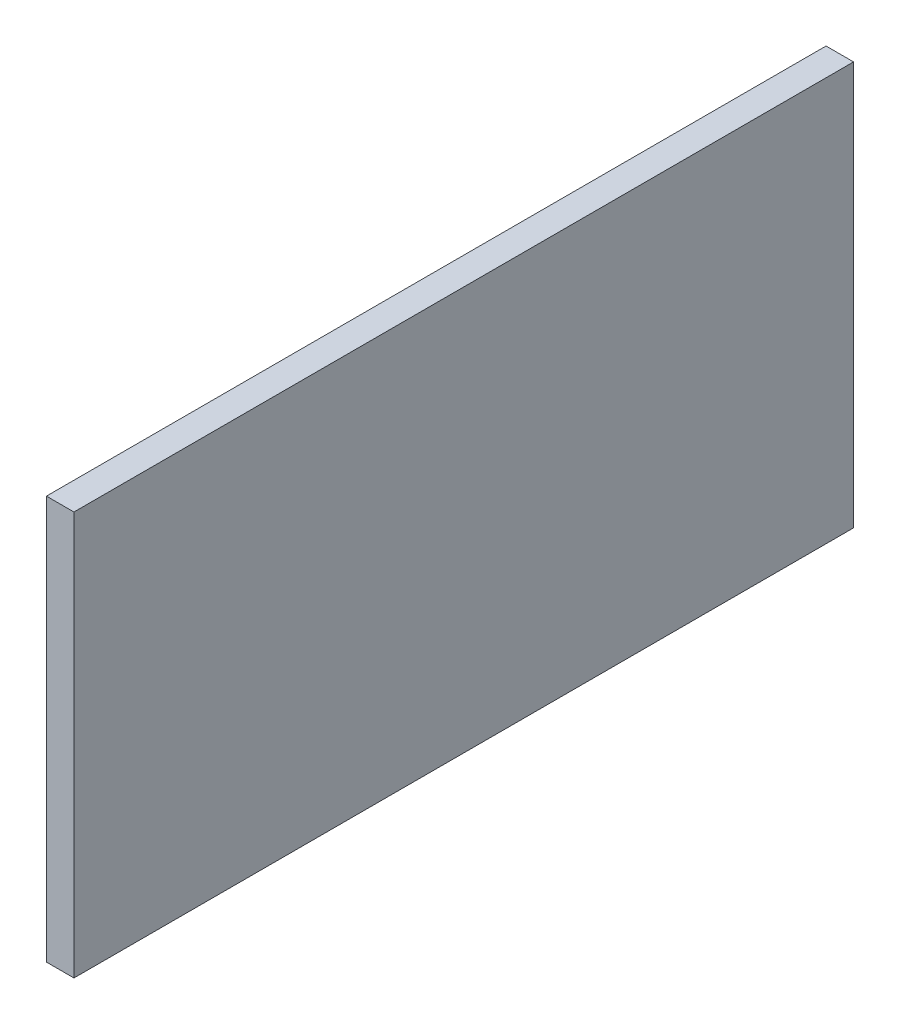
ISO-10303-21;
HEADER;
FILE_DESCRIPTION(('STEP AP214'),'2;1');
FILE_NAME('part.step','',(''),(''),'','','');
FILE_SCHEMA(('AUTOMOTIVE_DESIGN { 1 0 10303 214 1 1 1 1 }'));
ENDSEC;
DATA;
#1=APPLICATION_CONTEXT('core data for automotive mechanical design processes');
#2=APPLICATION_PROTOCOL_DEFINITION('international standard','automotive_design',2000,#1);
#3=PRODUCT_CONTEXT('',#1,'mechanical');
#4=PRODUCT('Part','Part','',(#3));
#5=PRODUCT_RELATED_PRODUCT_CATEGORY('part','',(#4));
#6=PRODUCT_DEFINITION_FORMATION('','',#4);
#7=PRODUCT_DEFINITION_CONTEXT('part definition',#1,'design');
#8=PRODUCT_DEFINITION('design','',#6,#7);
#9=PRODUCT_DEFINITION_SHAPE('','',#8);
#10=(LENGTH_UNIT() NAMED_UNIT(*) SI_UNIT(.MILLI.,.METRE.));
#11=(NAMED_UNIT(*) PLANE_ANGLE_UNIT() SI_UNIT($,.RADIAN.));
#12=(NAMED_UNIT(*) SI_UNIT($,.STERADIAN.) SOLID_ANGLE_UNIT());
#13=UNCERTAINTY_MEASURE_WITH_UNIT(LENGTH_MEASURE(1.E-05),#10,'distance_accuracy_value','');
#14=(GEOMETRIC_REPRESENTATION_CONTEXT(3) GLOBAL_UNCERTAINTY_ASSIGNED_CONTEXT((#13)) GLOBAL_UNIT_ASSIGNED_CONTEXT((#10,
#11,#12)) REPRESENTATION_CONTEXT('',''));
#15=CARTESIAN_POINT('',(0.,0.,0.));
#16=DIRECTION('',(0.,0.,1.));
#17=DIRECTION('',(1.,0.,0.));
#18=AXIS2_PLACEMENT_3D('',#15,#16,#17);
#19=CARTESIAN_POINT('',(122.,0.,0.));
#20=DIRECTION('',(-1.,0.,0.));
#21=DIRECTION('',(0.,0.,1.));
#22=AXIS2_PLACEMENT_3D('',#19,#20,#21);
#23=PLANE('',#22);
#24=DIRECTION('',(0.,-1.,0.));
#25=VECTOR('',#24,1.);
#26=CARTESIAN_POINT('',(122.,2.,47.));
#27=LINE('',#26,#25);
#28=CARTESIAN_POINT('',(122.,46.,47.));
#29=VERTEX_POINT('',#28);
#30=CARTESIAN_POINT('',(122.,2.,47.));
#31=VERTEX_POINT('',#30);
#32=EDGE_CURVE('E261',#29,#31,#27,.T.);
#33=ORIENTED_EDGE('',*,*,#32,.F.);
#34=DIRECTION('',(0.,0.,1.));
#35=VECTOR('',#34,1.);
#36=CARTESIAN_POINT('',(122.,46.,47.));
#37=LINE('',#36,#35);
#38=CARTESIAN_POINT('',(122.,46.,-38.));
#39=VERTEX_POINT('',#38);
#40=EDGE_CURVE('E267',#39,#29,#37,.T.);
#41=ORIENTED_EDGE('',*,*,#40,.F.);
#42=DIRECTION('',(0.,1.,0.));
#43=VECTOR('',#42,1.);
#44=CARTESIAN_POINT('',(122.,2.,-38.));
#45=LINE('',#44,#43);
#46=CARTESIAN_POINT('',(122.,2.,-38.));
#47=VERTEX_POINT('',#46);
#48=EDGE_CURVE('E283',#47,#39,#45,.T.);
#49=ORIENTED_EDGE('',*,*,#48,.F.);
#50=DIRECTION('',(0.,0.,-1.));
#51=VECTOR('',#50,1.);
#52=CARTESIAN_POINT('',(122.,2.,47.));
#53=LINE('',#52,#51);
#54=EDGE_CURVE('E280',#31,#47,#53,.T.);
#55=ORIENTED_EDGE('',*,*,#54,.F.);
#56=EDGE_LOOP('',(#33,#41,#49,#55));
#57=FACE_BOUND('',#56,.T.);
#58=DIRECTION('',(0.,0.,1.));
#59=VECTOR('',#58,1.);
#60=CARTESIAN_POINT('',(122.,25.,0.));
#61=LINE('',#60,#59);
#62=CARTESIAN_POINT('',(122.,25.,12.));
#63=VERTEX_POINT('',#62);
#64=CARTESIAN_POINT('',(122.,25.,16.2));
#65=VERTEX_POINT('',#64);
#66=EDGE_CURVE('E307',#63,#65,#61,.T.);
#67=ORIENTED_EDGE('',*,*,#66,.T.);
#68=DIRECTION('',(0.,-1.,0.));
#69=VECTOR('',#68,1.);
#70=CARTESIAN_POINT('',(122.,0.,16.2));
#71=LINE('',#70,#69);
#72=CARTESIAN_POINT('',(122.,12.,16.2));
#73=VERTEX_POINT('',#72);
#74=EDGE_CURVE('E313',#65,#73,#71,.T.);
#75=ORIENTED_EDGE('',*,*,#74,.T.);
#76=DIRECTION('',(0.,0.,-1.));
#77=VECTOR('',#76,1.);
#78=CARTESIAN_POINT('',(122.,12.,0.));
#79=LINE('',#78,#77);
#80=CARTESIAN_POINT('',(122.,12.,12.));
#81=VERTEX_POINT('',#80);
#82=EDGE_CURVE('E310',#73,#81,#79,.T.);
#83=ORIENTED_EDGE('',*,*,#82,.T.);
#84=DIRECTION('',(0.,-1.,0.));
#85=VECTOR('',#84,1.);
#86=CARTESIAN_POINT('',(122.,0.,12.));
#87=LINE('',#86,#85);
#88=EDGE_CURVE('E303',#63,#81,#87,.T.);
#89=ORIENTED_EDGE('',*,*,#88,.F.);
#90=EDGE_LOOP('',(#67,#75,#83,#89));
#91=FACE_BOUND('',#90,.T.);
#92=DIRECTION('',(0.,0.,1.));
#93=VECTOR('',#92,1.);
#94=CARTESIAN_POINT('',(122.,25.,0.));
#95=LINE('',#94,#93);
#96=CARTESIAN_POINT('',(122.,25.,-26.));
#97=VERTEX_POINT('',#96);
#98=CARTESIAN_POINT('',(122.,25.,-23.));
#99=VERTEX_POINT('',#98);
#100=EDGE_CURVE('E58',#97,#99,#95,.T.);
#101=ORIENTED_EDGE('',*,*,#100,.T.);
#102=DIRECTION('',(0.,-1.,0.));
#103=VECTOR('',#102,1.);
#104=CARTESIAN_POINT('',(122.,0.,-23.));
#105=LINE('',#104,#103);
#106=CARTESIAN_POINT('',(122.,12.,-23.));
#107=VERTEX_POINT('',#106);
#108=EDGE_CURVE('E11',#99,#107,#105,.T.);
#109=ORIENTED_EDGE('',*,*,#108,.T.);
#110=DIRECTION('',(0.,0.,-1.));
#111=VECTOR('',#110,1.);
#112=CARTESIAN_POINT('',(122.,12.,0.));
#113=LINE('',#112,#111);
#114=CARTESIAN_POINT('',(122.,12.,-26.));
#115=VERTEX_POINT('',#114);
#116=EDGE_CURVE('E48',#107,#115,#113,.T.);
#117=ORIENTED_EDGE('',*,*,#116,.T.);
#118=DIRECTION('',(0.,-1.,0.));
#119=VECTOR('',#118,1.);
#120=CARTESIAN_POINT('',(122.,0.,-26.));
#121=LINE('',#120,#119);
#122=EDGE_CURVE('E324',#97,#115,#121,.T.);
#123=ORIENTED_EDGE('',*,*,#122,.F.);
#124=EDGE_LOOP('',(#101,#109,#117,#123));
#125=FACE_BOUND('',#124,.T.);
#126=ADVANCED_FACE('F39',(#57,#91,#125),#23,.T.);
#127=CARTESIAN_POINT('',(125.,2.,47.));
#128=DIRECTION('',(0.,0.,-1.));
#129=DIRECTION('',(-1.,0.,0.));
#130=AXIS2_PLACEMENT_3D('',#127,#128,#129);
#131=PLANE('',#130);
#132=ORIENTED_EDGE('',*,*,#32,.T.);
#133=DIRECTION('',(-1.,0.,0.));
#134=VECTOR('',#133,1.);
#135=CARTESIAN_POINT('',(125.,2.,47.));
#136=LINE('',#135,#134);
#137=CARTESIAN_POINT('',(125.,2.,47.));
#138=VERTEX_POINT('',#137);
#139=EDGE_CURVE('E299',#138,#31,#136,.T.);
#140=ORIENTED_EDGE('',*,*,#139,.F.);
#141=DIRECTION('',(0.,-1.,0.));
#142=VECTOR('',#141,1.);
#143=CARTESIAN_POINT('',(125.,2.,47.));
#144=LINE('',#143,#142);
#145=CARTESIAN_POINT('',(125.,46.,47.));
#146=VERTEX_POINT('',#145);
#147=EDGE_CURVE('E262',#146,#138,#144,.T.);
#148=ORIENTED_EDGE('',*,*,#147,.F.);
#149=DIRECTION('',(-1.,0.,0.));
#150=VECTOR('',#149,1.);
#151=CARTESIAN_POINT('',(125.,46.,47.));
#152=LINE('',#151,#150);
#153=EDGE_CURVE('E276',#146,#29,#152,.T.);
#154=ORIENTED_EDGE('',*,*,#153,.T.);
#155=EDGE_LOOP('',(#132,#140,#148,#154));
#156=FACE_BOUND('',#155,.T.);
#157=ADVANCED_FACE('F41',(#156),#131,.F.);
#158=CARTESIAN_POINT('',(125.,2.,47.));
#159=DIRECTION('',(0.,1.,0.));
#160=DIRECTION('',(0.,0.,1.));
#161=AXIS2_PLACEMENT_3D('',#158,#159,#160);
#162=PLANE('',#161);
#163=ORIENTED_EDGE('',*,*,#54,.T.);
#164=DIRECTION('',(-1.,0.,0.));
#165=VECTOR('',#164,1.);
#166=CARTESIAN_POINT('',(125.,2.,-38.));
#167=LINE('',#166,#165);
#168=CARTESIAN_POINT('',(125.,2.,-38.));
#169=VERTEX_POINT('',#168);
#170=EDGE_CURVE('E295',#169,#47,#167,.T.);
#171=ORIENTED_EDGE('',*,*,#170,.F.);
#172=DIRECTION('',(0.,0.,-1.));
#173=VECTOR('',#172,1.);
#174=CARTESIAN_POINT('',(125.,2.,47.));
#175=LINE('',#174,#173);
#176=EDGE_CURVE('E266',#138,#169,#175,.T.);
#177=ORIENTED_EDGE('',*,*,#176,.F.);
#178=ORIENTED_EDGE('',*,*,#139,.T.);
#179=EDGE_LOOP('',(#163,#171,#177,#178));
#180=FACE_BOUND('',#179,.T.);
#181=ADVANCED_FACE('F351',(#180),#162,.F.);
#182=CARTESIAN_POINT('',(125.,2.,-38.));
#183=DIRECTION('',(0.,0.,1.));
#184=DIRECTION('',(1.,0.,0.));
#185=AXIS2_PLACEMENT_3D('',#182,#183,#184);
#186=PLANE('',#185);
#187=ORIENTED_EDGE('',*,*,#48,.T.);
#188=DIRECTION('',(-1.,0.,0.));
#189=VECTOR('',#188,1.);
#190=CARTESIAN_POINT('',(125.,46.,-38.));
#191=LINE('',#190,#189);
#192=CARTESIAN_POINT('',(125.,46.,-38.));
#193=VERTEX_POINT('',#192);
#194=EDGE_CURVE('E291',#193,#39,#191,.T.);
#195=ORIENTED_EDGE('',*,*,#194,.F.);
#196=DIRECTION('',(0.,1.,0.));
#197=VECTOR('',#196,1.);
#198=CARTESIAN_POINT('',(125.,2.,-38.));
#199=LINE('',#198,#197);
#200=EDGE_CURVE('E270',#169,#193,#199,.T.);
#201=ORIENTED_EDGE('',*,*,#200,.F.);
#202=ORIENTED_EDGE('',*,*,#170,.T.);
#203=EDGE_LOOP('',(#187,#195,#201,#202));
#204=FACE_BOUND('',#203,.T.);
#205=ADVANCED_FACE('F362',(#204),#186,.F.);
#206=CARTESIAN_POINT('',(125.,46.,47.));
#207=DIRECTION('',(0.,-1.,0.));
#208=DIRECTION('',(0.,0.,-1.));
#209=AXIS2_PLACEMENT_3D('',#206,#207,#208);
#210=PLANE('',#209);
#211=ORIENTED_EDGE('',*,*,#40,.T.);
#212=ORIENTED_EDGE('',*,*,#153,.F.);
#213=DIRECTION('',(0.,0.,1.));
#214=VECTOR('',#213,1.);
#215=CARTESIAN_POINT('',(125.,46.,47.));
#216=LINE('',#215,#214);
#217=EDGE_CURVE('E273',#193,#146,#216,.T.);
#218=ORIENTED_EDGE('',*,*,#217,.F.);
#219=ORIENTED_EDGE('',*,*,#194,.T.);
#220=EDGE_LOOP('',(#211,#212,#218,#219));
#221=FACE_BOUND('',#220,.T.);
#222=ADVANCED_FACE('F359',(#221),#210,.F.);
#223=CARTESIAN_POINT('',(125.,0.,0.));
#224=DIRECTION('',(-1.,0.,0.));
#225=DIRECTION('',(0.,0.,1.));
#226=AXIS2_PLACEMENT_3D('',#223,#224,#225);
#227=PLANE('',#226);
#228=ORIENTED_EDGE('',*,*,#147,.T.);
#229=ORIENTED_EDGE('',*,*,#176,.T.);
#230=ORIENTED_EDGE('',*,*,#200,.T.);
#231=ORIENTED_EDGE('',*,*,#217,.T.);
#232=EDGE_LOOP('',(#228,#229,#230,#231));
#233=FACE_BOUND('',#232,.T.);
#234=ADVANCED_FACE('F357',(#233),#227,.F.);
#235=CARTESIAN_POINT('',(108.2,12.,16.2));
#236=DIRECTION('',(0.,1.,0.));
#237=DIRECTION('',(0.,0.,1.));
#238=AXIS2_PLACEMENT_3D('',#235,#236,#237);
#239=PLANE('',#238);
#240=ORIENTED_EDGE('',*,*,#82,.F.);
#241=DIRECTION('',(1.,0.,0.));
#242=VECTOR('',#241,1.);
#243=CARTESIAN_POINT('',(108.2,12.,16.2));
#244=LINE('',#243,#242);
#245=CARTESIAN_POINT('',(108.2,12.,16.2));
#246=VERTEX_POINT('',#245);
#247=EDGE_CURVE('E240',#246,#73,#244,.T.);
#248=ORIENTED_EDGE('',*,*,#247,.F.);
#249=DIRECTION('',(0.,0.,-1.));
#250=VECTOR('',#249,1.);
#251=CARTESIAN_POINT('',(108.2,12.,16.2));
#252=LINE('',#251,#250);
#253=CARTESIAN_POINT('',(108.2,12.,12.));
#254=VERTEX_POINT('',#253);
#255=EDGE_CURVE('E257',#246,#254,#252,.T.);
#256=ORIENTED_EDGE('',*,*,#255,.T.);
#257=DIRECTION('',(1.,0.,0.));
#258=VECTOR('',#257,1.);
#259=CARTESIAN_POINT('',(108.2,12.,12.));
#260=LINE('',#259,#258);
#261=EDGE_CURVE('E236',#254,#81,#260,.T.);
#262=ORIENTED_EDGE('',*,*,#261,.T.);
#263=EDGE_LOOP('',(#240,#248,#256,#262));
#264=FACE_BOUND('',#263,.T.);
#265=ADVANCED_FACE('F381',(#264),#239,.F.);
#266=CARTESIAN_POINT('',(108.2,25.,16.2));
#267=DIRECTION('',(0.,-1.,0.));
#268=DIRECTION('',(0.,0.,-1.));
#269=AXIS2_PLACEMENT_3D('',#266,#267,#268);
#270=PLANE('',#269);
#271=ORIENTED_EDGE('',*,*,#66,.F.);
#272=DIRECTION('',(-1.,0.,0.));
#273=VECTOR('',#272,1.);
#274=CARTESIAN_POINT('',(108.2,25.,12.));
#275=LINE('',#274,#273);
#276=CARTESIAN_POINT('',(108.2,25.,12.));
#277=VERTEX_POINT('',#276);
#278=EDGE_CURVE('E245',#63,#277,#275,.T.);
#279=ORIENTED_EDGE('',*,*,#278,.T.);
#280=DIRECTION('',(0.,0.,-1.));
#281=VECTOR('',#280,1.);
#282=CARTESIAN_POINT('',(108.2,25.,16.2));
#283=LINE('',#282,#281);
#284=CARTESIAN_POINT('',(108.2,25.,16.2));
#285=VERTEX_POINT('',#284);
#286=EDGE_CURVE('E248',#285,#277,#283,.T.);
#287=ORIENTED_EDGE('',*,*,#286,.F.);
#288=DIRECTION('',(-1.,0.,0.));
#289=VECTOR('',#288,1.);
#290=CARTESIAN_POINT('',(108.2,25.,16.2));
#291=LINE('',#290,#289);
#292=EDGE_CURVE('E244',#65,#285,#291,.T.);
#293=ORIENTED_EDGE('',*,*,#292,.F.);
#294=EDGE_LOOP('',(#271,#279,#287,#293));
#295=FACE_BOUND('',#294,.T.);
#296=ADVANCED_FACE('F385',(#295),#270,.F.);
#297=CARTESIAN_POINT('',(0.,0.,16.2));
#298=DIRECTION('',(0.,0.,-1.));
#299=DIRECTION('',(-1.,0.,0.));
#300=AXIS2_PLACEMENT_3D('',#297,#298,#299);
#301=PLANE('',#300);
#302=CARTESIAN_POINT('',(108.2,18.5,16.2));
#303=DIRECTION('',(0.,0.,1.));
#304=DIRECTION('',(1.,0.,0.));
#305=AXIS2_PLACEMENT_3D('',#302,#303,#304);
#306=CIRCLE('',#305,3.55);
#307=CARTESIAN_POINT('',(108.835894584196,21.9925832957554,16.2));
#308=VERTEX_POINT('',#307);
#309=CARTESIAN_POINT('',(108.835894584196,15.0074167042445,16.2));
#310=VERTEX_POINT('',#309);
#311=EDGE_CURVE('E222',#308,#310,#306,.T.);
#312=ORIENTED_EDGE('',*,*,#311,.F.);
#313=DIRECTION('',(-0.995948362239352,0.0899269689956982,0.));
#314=VECTOR('',#313,1.);
#315=CARTESIAN_POINT('',(120.9,20.9032814053959,16.2));
#316=LINE('',#315,#314);
#317=CARTESIAN_POINT('',(120.9,20.9032814053959,16.2));
#318=VERTEX_POINT('',#317);
#319=EDGE_CURVE('E202',#318,#308,#316,.T.);
#320=ORIENTED_EDGE('',*,*,#319,.F.);
#321=DIRECTION('',(0.,1.,0.));
#322=VECTOR('',#321,1.);
#323=CARTESIAN_POINT('',(120.9,16.0967185946041,16.2));
#324=LINE('',#323,#322);
#325=CARTESIAN_POINT('',(120.9,16.0967185946041,16.2));
#326=VERTEX_POINT('',#325);
#327=EDGE_CURVE('E213',#326,#318,#324,.T.);
#328=ORIENTED_EDGE('',*,*,#327,.F.);
#329=DIRECTION('',(0.995948362239352,0.0899269689956982,0.));
#330=VECTOR('',#329,1.);
#331=CARTESIAN_POINT('',(108.2,14.95,16.2));
#332=LINE('',#331,#330);
#333=EDGE_CURVE('E196',#310,#326,#332,.T.);
#334=ORIENTED_EDGE('',*,*,#333,.F.);
#335=EDGE_LOOP('',(#312,#320,#328,#334));
#336=FACE_BOUND('',#335,.T.);
#337=ORIENTED_EDGE('',*,*,#292,.T.);
#338=CARTESIAN_POINT('',(108.2,18.5,16.2));
#339=DIRECTION('',(0.,0.,1.));
#340=DIRECTION('',(1.,0.,0.));
#341=AXIS2_PLACEMENT_3D('',#338,#339,#340);
#342=CIRCLE('',#341,6.50000000000001);
#343=EDGE_CURVE('E232',#285,#246,#342,.T.);
#344=ORIENTED_EDGE('',*,*,#343,.T.);
#345=ORIENTED_EDGE('',*,*,#247,.T.);
#346=ORIENTED_EDGE('',*,*,#74,.F.);
#347=EDGE_LOOP('',(#337,#344,#345,#346));
#348=FACE_BOUND('',#347,.T.);
#349=ADVANCED_FACE('F390',(#336,#348),#301,.F.);
#350=CARTESIAN_POINT('',(0.,0.,12.));
#351=DIRECTION('',(0.,0.,-1.));
#352=DIRECTION('',(-1.,0.,0.));
#353=AXIS2_PLACEMENT_3D('',#350,#351,#352);
#354=PLANE('',#353);
#355=DIRECTION('',(-0.995948362239352,0.0899269689956982,0.));
#356=VECTOR('',#355,1.);
#357=CARTESIAN_POINT('',(120.9,20.9032814053959,12.));
#358=LINE('',#357,#356);
#359=CARTESIAN_POINT('',(120.9,20.9032814053959,12.));
#360=VERTEX_POINT('',#359);
#361=CARTESIAN_POINT('',(108.835894584196,21.9925832957554,12.));
#362=VERTEX_POINT('',#361);
#363=EDGE_CURVE('E206',#360,#362,#358,.T.);
#364=ORIENTED_EDGE('',*,*,#363,.T.);
#365=CARTESIAN_POINT('',(108.2,18.5,12.));
#366=DIRECTION('',(0.,0.,1.));
#367=DIRECTION('',(1.,0.,0.));
#368=AXIS2_PLACEMENT_3D('',#365,#366,#367);
#369=CIRCLE('',#368,3.55);
#370=CARTESIAN_POINT('',(108.835894584196,15.0074167042445,12.));
#371=VERTEX_POINT('',#370);
#372=EDGE_CURVE('E226',#362,#371,#369,.T.);
#373=ORIENTED_EDGE('',*,*,#372,.T.);
#374=DIRECTION('',(0.995948362239352,0.0899269689956982,0.));
#375=VECTOR('',#374,1.);
#376=CARTESIAN_POINT('',(108.2,14.95,12.));
#377=LINE('',#376,#375);
#378=CARTESIAN_POINT('',(120.9,16.0967185946041,12.));
#379=VERTEX_POINT('',#378);
#380=EDGE_CURVE('E197',#371,#379,#377,.T.);
#381=ORIENTED_EDGE('',*,*,#380,.T.);
#382=DIRECTION('',(0.,1.,0.));
#383=VECTOR('',#382,1.);
#384=CARTESIAN_POINT('',(120.9,16.0967185946041,12.));
#385=LINE('',#384,#383);
#386=EDGE_CURVE('E201',#379,#360,#385,.T.);
#387=ORIENTED_EDGE('',*,*,#386,.T.);
#388=EDGE_LOOP('',(#364,#373,#381,#387));
#389=FACE_BOUND('',#388,.T.);
#390=ORIENTED_EDGE('',*,*,#261,.F.);
#391=CARTESIAN_POINT('',(108.2,18.5,12.));
#392=DIRECTION('',(0.,0.,1.));
#393=DIRECTION('',(1.,0.,0.));
#394=AXIS2_PLACEMENT_3D('',#391,#392,#393);
#395=CIRCLE('',#394,6.50000000000001);
#396=EDGE_CURVE('E229',#277,#254,#395,.T.);
#397=ORIENTED_EDGE('',*,*,#396,.F.);
#398=ORIENTED_EDGE('',*,*,#278,.F.);
#399=ORIENTED_EDGE('',*,*,#88,.T.);
#400=EDGE_LOOP('',(#390,#397,#398,#399));
#401=FACE_BOUND('',#400,.T.);
#402=ADVANCED_FACE('F395',(#389,#401),#354,.T.);
#403=CARTESIAN_POINT('',(108.2,18.5,16.2));
#404=DIRECTION('',(0.,0.,-1.));
#405=DIRECTION('',(-1.,0.,0.));
#406=AXIS2_PLACEMENT_3D('',#403,#404,#405);
#407=CYLINDRICAL_SURFACE('',#406,6.50000000000001);
#408=ORIENTED_EDGE('',*,*,#396,.T.);
#409=ORIENTED_EDGE('',*,*,#255,.F.);
#410=ORIENTED_EDGE('',*,*,#343,.F.);
#411=ORIENTED_EDGE('',*,*,#286,.T.);
#412=EDGE_LOOP('',(#408,#409,#410,#411));
#413=FACE_BOUND('',#412,.T.);
#414=ADVANCED_FACE('F398',(#413),#407,.T.);
#415=CARTESIAN_POINT('',(108.2,18.5,12.));
#416=DIRECTION('',(0.,0.,1.));
#417=DIRECTION('',(1.,0.,0.));
#418=AXIS2_PLACEMENT_3D('',#415,#416,#417);
#419=CYLINDRICAL_SURFACE('',#418,3.55);
#420=ORIENTED_EDGE('',*,*,#311,.T.);
#421=DIRECTION('',(0.,0.,1.));
#422=VECTOR('',#421,1.);
#423=CARTESIAN_POINT('',(108.835894584196,15.0074167042445,12.));
#424=LINE('',#423,#422);
#425=EDGE_CURVE('E316',#310,#371,#424,.F.);
#426=ORIENTED_EDGE('',*,*,#425,.T.);
#427=ORIENTED_EDGE('',*,*,#372,.F.);
#428=DIRECTION('',(0.,0.,1.));
#429=VECTOR('',#428,1.);
#430=CARTESIAN_POINT('',(108.835894584196,21.9925832957554,12.));
#431=LINE('',#430,#429);
#432=EDGE_CURVE('E320',#362,#308,#431,.T.);
#433=ORIENTED_EDGE('',*,*,#432,.T.);
#434=EDGE_LOOP('',(#420,#426,#427,#433));
#435=FACE_BOUND('',#434,.T.);
#436=ADVANCED_FACE('F405',(#435),#419,.F.);
#437=CARTESIAN_POINT('',(120.9,20.9032814053959,12.));
#438=DIRECTION('',(0.0899269689956982,0.995948362239352,0.));
#439=DIRECTION('',(-0.995948362239352,0.0899269689956982,0.));
#440=AXIS2_PLACEMENT_3D('',#437,#438,#439);
#441=PLANE('',#440);
#442=ORIENTED_EDGE('',*,*,#363,.F.);
#443=DIRECTION('',(0.,0.,1.));
#444=VECTOR('',#443,1.);
#445=CARTESIAN_POINT('',(120.9,20.9032814053959,12.));
#446=LINE('',#445,#444);
#447=EDGE_CURVE('E219',#360,#318,#446,.T.);
#448=ORIENTED_EDGE('',*,*,#447,.T.);
#449=ORIENTED_EDGE('',*,*,#319,.T.);
#450=ORIENTED_EDGE('',*,*,#432,.F.);
#451=EDGE_LOOP('',(#442,#448,#449,#450));
#452=FACE_BOUND('',#451,.T.);
#453=ADVANCED_FACE('F409',(#452),#441,.F.);
#454=CARTESIAN_POINT('',(108.2,14.95,12.));
#455=DIRECTION('',(0.0899269689956982,-0.995948362239352,0.));
#456=DIRECTION('',(0.995948362239352,0.0899269689956982,0.));
#457=AXIS2_PLACEMENT_3D('',#454,#455,#456);
#458=PLANE('',#457);
#459=ORIENTED_EDGE('',*,*,#333,.T.);
#460=DIRECTION('',(0.,0.,1.));
#461=VECTOR('',#460,1.);
#462=CARTESIAN_POINT('',(120.9,16.0967185946041,12.));
#463=LINE('',#462,#461);
#464=EDGE_CURVE('E210',#379,#326,#463,.T.);
#465=ORIENTED_EDGE('',*,*,#464,.F.);
#466=ORIENTED_EDGE('',*,*,#380,.F.);
#467=ORIENTED_EDGE('',*,*,#425,.F.);
#468=EDGE_LOOP('',(#459,#465,#466,#467));
#469=FACE_BOUND('',#468,.T.);
#470=ADVANCED_FACE('F411',(#469),#458,.F.);
#471=CARTESIAN_POINT('',(120.9,16.0967185946041,12.));
#472=DIRECTION('',(1.,0.,0.));
#473=DIRECTION('',(0.,0.,-1.));
#474=AXIS2_PLACEMENT_3D('',#471,#472,#473);
#475=PLANE('',#474);
#476=ORIENTED_EDGE('',*,*,#327,.T.);
#477=ORIENTED_EDGE('',*,*,#447,.F.);
#478=ORIENTED_EDGE('',*,*,#386,.F.);
#479=ORIENTED_EDGE('',*,*,#464,.T.);
#480=EDGE_LOOP('',(#476,#477,#478,#479));
#481=FACE_BOUND('',#480,.T.);
#482=ADVANCED_FACE('F414',(#481),#475,.F.);
#483=CARTESIAN_POINT('',(108.2,12.,-23.));
#484=DIRECTION('',(0.,1.,0.));
#485=DIRECTION('',(0.,0.,1.));
#486=AXIS2_PLACEMENT_3D('',#483,#484,#485);
#487=PLANE('',#486);
#488=ORIENTED_EDGE('',*,*,#116,.F.);
#489=DIRECTION('',(1.,0.,0.));
#490=VECTOR('',#489,1.);
#491=CARTESIAN_POINT('',(108.2,12.,-23.));
#492=LINE('',#491,#490);
#493=CARTESIAN_POINT('',(108.2,12.,-23.));
#494=VERTEX_POINT('',#493);
#495=EDGE_CURVE('E159',#494,#107,#492,.T.);
#496=ORIENTED_EDGE('',*,*,#495,.F.);
#497=DIRECTION('',(0.,0.,-1.));
#498=VECTOR('',#497,1.);
#499=CARTESIAN_POINT('',(108.2,12.,-23.));
#500=LINE('',#499,#498);
#501=CARTESIAN_POINT('',(108.2,12.,-26.));
#502=VERTEX_POINT('',#501);
#503=EDGE_CURVE('E170',#494,#502,#500,.T.);
#504=ORIENTED_EDGE('',*,*,#503,.T.);
#505=DIRECTION('',(1.,0.,0.));
#506=VECTOR('',#505,1.);
#507=CARTESIAN_POINT('',(108.2,12.,-26.));
#508=LINE('',#507,#506);
#509=EDGE_CURVE('E160',#502,#115,#508,.T.);
#510=ORIENTED_EDGE('',*,*,#509,.T.);
#511=EDGE_LOOP('',(#488,#496,#504,#510));
#512=FACE_BOUND('',#511,.T.);
#513=ADVANCED_FACE('F330',(#512),#487,.F.);
#514=CARTESIAN_POINT('',(108.2,25.,-23.));
#515=DIRECTION('',(0.,-1.,0.));
#516=DIRECTION('',(0.,0.,-1.));
#517=AXIS2_PLACEMENT_3D('',#514,#515,#516);
#518=PLANE('',#517);
#519=ORIENTED_EDGE('',*,*,#100,.F.);
#520=DIRECTION('',(-1.,0.,0.));
#521=VECTOR('',#520,1.);
#522=CARTESIAN_POINT('',(108.2,25.,-26.));
#523=LINE('',#522,#521);
#524=CARTESIAN_POINT('',(108.2,25.,-26.));
#525=VERTEX_POINT('',#524);
#526=EDGE_CURVE('E149',#97,#525,#523,.T.);
#527=ORIENTED_EDGE('',*,*,#526,.T.);
#528=DIRECTION('',(0.,0.,-1.));
#529=VECTOR('',#528,1.);
#530=CARTESIAN_POINT('',(108.2,25.,-23.));
#531=LINE('',#530,#529);
#532=CARTESIAN_POINT('',(108.2,25.,-23.));
#533=VERTEX_POINT('',#532);
#534=EDGE_CURVE('E153',#533,#525,#531,.T.);
#535=ORIENTED_EDGE('',*,*,#534,.F.);
#536=DIRECTION('',(-1.,0.,0.));
#537=VECTOR('',#536,1.);
#538=CARTESIAN_POINT('',(108.2,25.,-23.));
#539=LINE('',#538,#537);
#540=EDGE_CURVE('E171',#99,#533,#539,.T.);
#541=ORIENTED_EDGE('',*,*,#540,.F.);
#542=EDGE_LOOP('',(#519,#527,#535,#541));
#543=FACE_BOUND('',#542,.T.);
#544=ADVANCED_FACE('F151',(#543),#518,.F.);
#545=CARTESIAN_POINT('',(0.,0.,-23.));
#546=DIRECTION('',(0.,0.,-1.));
#547=DIRECTION('',(-1.,0.,0.));
#548=AXIS2_PLACEMENT_3D('',#545,#546,#547);
#549=PLANE('',#548);
#550=CARTESIAN_POINT('',(108.2,18.5,-23.));
#551=DIRECTION('',(0.,0.,1.));
#552=DIRECTION('',(1.,0.,0.));
#553=AXIS2_PLACEMENT_3D('',#550,#551,#552);
#554=CIRCLE('',#553,2.94999999999999);
#555=CARTESIAN_POINT('',(111.15,18.5,-23.));
#556=VERTEX_POINT('',#555);
#557=EDGE_CURVE('E183',#556,#556,#554,.T.);
#558=ORIENTED_EDGE('',*,*,#557,.F.);
#559=EDGE_LOOP('',(#558));
#560=FACE_BOUND('',#559,.T.);
#561=ORIENTED_EDGE('',*,*,#540,.T.);
#562=CARTESIAN_POINT('',(108.2,18.5,-23.));
#563=DIRECTION('',(0.,0.,1.));
#564=DIRECTION('',(1.,0.,0.));
#565=AXIS2_PLACEMENT_3D('',#562,#563,#564);
#566=CIRCLE('',#565,6.50000000000001);
#567=EDGE_CURVE('E168',#533,#494,#566,.T.);
#568=ORIENTED_EDGE('',*,*,#567,.T.);
#569=ORIENTED_EDGE('',*,*,#495,.T.);
#570=ORIENTED_EDGE('',*,*,#108,.F.);
#571=EDGE_LOOP('',(#561,#568,#569,#570));
#572=FACE_BOUND('',#571,.T.);
#573=ADVANCED_FACE('F332',(#560,#572),#549,.F.);
#574=CARTESIAN_POINT('',(0.,0.,-26.));
#575=DIRECTION('',(0.,0.,-1.));
#576=DIRECTION('',(-1.,0.,0.));
#577=AXIS2_PLACEMENT_3D('',#574,#575,#576);
#578=PLANE('',#577);
#579=CARTESIAN_POINT('',(108.2,18.5,-26.));
#580=DIRECTION('',(0.,0.,1.));
#581=DIRECTION('',(1.,0.,0.));
#582=AXIS2_PLACEMENT_3D('',#579,#580,#581);
#583=CIRCLE('',#582,2.94999999999999);
#584=CARTESIAN_POINT('',(111.15,18.5,-26.));
#585=VERTEX_POINT('',#584);
#586=EDGE_CURVE('E177',#585,#585,#583,.T.);
#587=ORIENTED_EDGE('',*,*,#586,.T.);
#588=EDGE_LOOP('',(#587));
#589=FACE_BOUND('',#588,.T.);
#590=ORIENTED_EDGE('',*,*,#509,.F.);
#591=CARTESIAN_POINT('',(108.2,18.5,-26.));
#592=DIRECTION('',(0.,0.,1.));
#593=DIRECTION('',(1.,0.,0.));
#594=AXIS2_PLACEMENT_3D('',#591,#592,#593);
#595=CIRCLE('',#594,6.50000000000001);
#596=EDGE_CURVE('E166',#525,#502,#595,.T.);
#597=ORIENTED_EDGE('',*,*,#596,.F.);
#598=ORIENTED_EDGE('',*,*,#526,.F.);
#599=ORIENTED_EDGE('',*,*,#122,.T.);
#600=EDGE_LOOP('',(#590,#597,#598,#599));
#601=FACE_BOUND('',#600,.T.);
#602=ADVANCED_FACE('F173',(#589,#601),#578,.T.);
#603=CARTESIAN_POINT('',(108.2,18.5,-23.));
#604=DIRECTION('',(0.,0.,-1.));
#605=DIRECTION('',(-1.,0.,0.));
#606=AXIS2_PLACEMENT_3D('',#603,#604,#605);
#607=CYLINDRICAL_SURFACE('',#606,6.50000000000001);
#608=ORIENTED_EDGE('',*,*,#596,.T.);
#609=ORIENTED_EDGE('',*,*,#503,.F.);
#610=ORIENTED_EDGE('',*,*,#567,.F.);
#611=ORIENTED_EDGE('',*,*,#534,.T.);
#612=EDGE_LOOP('',(#608,#609,#610,#611));
#613=FACE_BOUND('',#612,.T.);
#614=ADVANCED_FACE('F164',(#613),#607,.T.);
#615=CARTESIAN_POINT('',(108.2,18.5,-26.));
#616=DIRECTION('',(0.,0.,1.));
#617=DIRECTION('',(1.,0.,0.));
#618=AXIS2_PLACEMENT_3D('',#615,#616,#617);
#619=CYLINDRICAL_SURFACE('',#618,2.94999999999999);
#620=CARTESIAN_POINT('',(111.15,18.5,-26.));
#621=CARTESIAN_POINT('',(111.15,18.5,-25.96875));
#622=CARTESIAN_POINT('',(111.15,18.5,-25.9375));
#623=CARTESIAN_POINT('',(111.15,18.5,-25.875));
#624=CARTESIAN_POINT('',(111.15,18.5,-25.84375));
#625=CARTESIAN_POINT('',(111.15,18.5,-25.78125));
#626=CARTESIAN_POINT('',(111.15,18.5,-25.75));
#627=CARTESIAN_POINT('',(111.15,18.5,-25.6875));
#628=CARTESIAN_POINT('',(111.15,18.5,-25.65625));
#629=CARTESIAN_POINT('',(111.15,18.5,-25.59375));
#630=CARTESIAN_POINT('',(111.15,18.5,-25.5625));
#631=CARTESIAN_POINT('',(111.15,18.5,-25.5));
#632=CARTESIAN_POINT('',(111.15,18.5,-25.46875));
#633=CARTESIAN_POINT('',(111.15,18.5,-25.40625));
#634=CARTESIAN_POINT('',(111.15,18.5,-25.375));
#635=CARTESIAN_POINT('',(111.15,18.5,-25.3125));
#636=CARTESIAN_POINT('',(111.15,18.5,-25.28125));
#637=CARTESIAN_POINT('',(111.15,18.5,-25.21875));
#638=CARTESIAN_POINT('',(111.15,18.5,-25.1875));
#639=CARTESIAN_POINT('',(111.15,18.5,-25.125));
#640=CARTESIAN_POINT('',(111.15,18.5,-25.09375));
#641=CARTESIAN_POINT('',(111.15,18.5,-25.03125));
#642=CARTESIAN_POINT('',(111.15,18.5,-25.));
#643=CARTESIAN_POINT('',(111.15,18.5,-24.9375));
#644=CARTESIAN_POINT('',(111.15,18.5,-24.90625));
#645=CARTESIAN_POINT('',(111.15,18.5,-24.84375));
#646=CARTESIAN_POINT('',(111.15,18.5,-24.8125));
#647=CARTESIAN_POINT('',(111.15,18.5,-24.75));
#648=CARTESIAN_POINT('',(111.15,18.5,-24.71875));
#649=CARTESIAN_POINT('',(111.15,18.5,-24.65625));
#650=CARTESIAN_POINT('',(111.15,18.5,-24.625));
#651=CARTESIAN_POINT('',(111.15,18.5,-24.5625));
#652=CARTESIAN_POINT('',(111.15,18.5,-24.53125));
#653=CARTESIAN_POINT('',(111.15,18.5,-24.46875));
#654=CARTESIAN_POINT('',(111.15,18.5,-24.4375));
#655=CARTESIAN_POINT('',(111.15,18.5,-24.375));
#656=CARTESIAN_POINT('',(111.15,18.5,-24.34375));
#657=CARTESIAN_POINT('',(111.15,18.5,-24.28125));
#658=CARTESIAN_POINT('',(111.15,18.5,-24.25));
#659=CARTESIAN_POINT('',(111.15,18.5,-24.1875));
#660=CARTESIAN_POINT('',(111.15,18.5,-24.15625));
#661=CARTESIAN_POINT('',(111.15,18.5,-24.09375));
#662=CARTESIAN_POINT('',(111.15,18.5,-24.0625));
#663=CARTESIAN_POINT('',(111.15,18.5,-24.));
#664=CARTESIAN_POINT('',(111.15,18.5,-23.96875));
#665=CARTESIAN_POINT('',(111.15,18.5,-23.90625));
#666=CARTESIAN_POINT('',(111.15,18.5,-23.875));
#667=CARTESIAN_POINT('',(111.15,18.5,-23.8125));
#668=CARTESIAN_POINT('',(111.15,18.5,-23.78125));
#669=CARTESIAN_POINT('',(111.15,18.5,-23.71875));
#670=CARTESIAN_POINT('',(111.15,18.5,-23.6875));
#671=CARTESIAN_POINT('',(111.15,18.5,-23.625));
#672=CARTESIAN_POINT('',(111.15,18.5,-23.59375));
#673=CARTESIAN_POINT('',(111.15,18.5,-23.53125));
#674=CARTESIAN_POINT('',(111.15,18.5,-23.5));
#675=CARTESIAN_POINT('',(111.15,18.5,-23.4375));
#676=CARTESIAN_POINT('',(111.15,18.5,-23.40625));
#677=CARTESIAN_POINT('',(111.15,18.5,-23.34375));
#678=CARTESIAN_POINT('',(111.15,18.5,-23.3125));
#679=CARTESIAN_POINT('',(111.15,18.5,-23.25));
#680=CARTESIAN_POINT('',(111.15,18.5,-23.21875));
#681=CARTESIAN_POINT('',(111.15,18.5,-23.15625));
#682=CARTESIAN_POINT('',(111.15,18.5,-23.125));
#683=CARTESIAN_POINT('',(111.15,18.5,-23.0625));
#684=CARTESIAN_POINT('',(111.15,18.5,-23.03125));
#685=CARTESIAN_POINT('',(111.15,18.5,-23.));
#686=B_SPLINE_CURVE_WITH_KNOTS('',3,(#620,#621,#622,#623,#624,#625,#626,#627,#628,#629,#630,
#631,#632,#633,#634,#635,#636,#637,#638,#639,#640,#641,#642,#643,#644,#645,#646,#647,#648,#649,
#650,#651,#652,#653,#654,#655,#656,#657,#658,#659,#660,#661,#662,#663,#664,#665,#666,#667,#668,
#669,#670,#671,#672,#673,#674,#675,#676,#677,#678,#679,#680,#681,#682,#683,#684,#685),
.UNSPECIFIED.,.F.,.F.,(4,2,2,2,2,2,2,2,2,2,2,2,2,2,2,2,2,2,2,2,2,2,2,2,2,2,2,2,2,2,2,2,4),(0.,
0.0937500000000001,0.1875,0.28125,0.375,0.46875,0.5625,0.656250000000001,0.750000000000001,
0.843750000000001,0.937500000000001,1.03125,1.125,1.21875,1.3125,1.40625,1.5,1.59375,1.6875,
1.78125,1.875,1.96875,2.0625,2.15625,2.25,2.34375,2.4375,2.53125,2.625,2.71875,2.8125,2.90625,
3.),.UNSPECIFIED.);
#687=EDGE_CURVE('BSEAM440',#585,#556,#686,.T.);
#688=ORIENTED_EDGE('',*,*,#586,.F.);
#689=ORIENTED_EDGE('',*,*,#557,.T.);
#690=ORIENTED_EDGE('',*,*,#687,.T.);
#691=ORIENTED_EDGE('',*,*,#687,.F.);
#692=EDGE_LOOP('',(#688,#690,#689,#691));
#693=FACE_BOUND('',#692,.T.);
#694=ADVANCED_FACE('F440',(#693),#619,.F.);
#695=CLOSED_SHELL('',(#126,#157,#181,#205,#222,#234,#265,#296,#349,#402,#414,#436,#453,#470,
#482,#513,#544,#573,#602,#614,#694));
#696=MANIFOLD_SOLID_BREP('B2',#695);
#697=ADVANCED_BREP_SHAPE_REPRESENTATION('',(#18,#696),#14);
#698=SHAPE_DEFINITION_REPRESENTATION(#9,#697);
ENDSEC;
END-ISO-10303-21;
